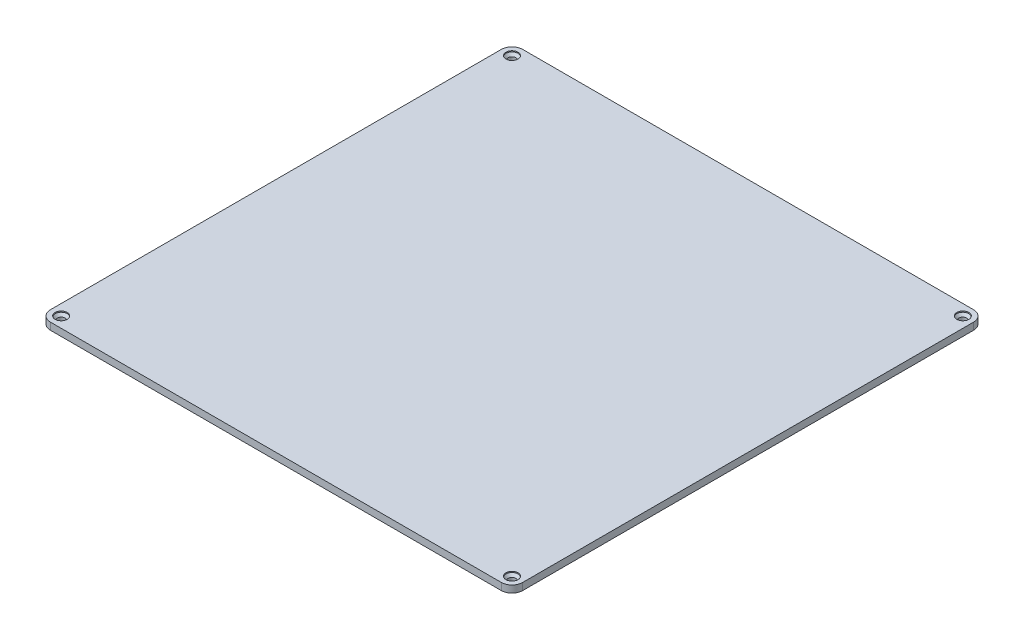
ISO-10303-21;
HEADER;
FILE_DESCRIPTION(('STEP AP214'),'2;1');
FILE_NAME('part.step','',(''),(''),'','','');
FILE_SCHEMA(('AUTOMOTIVE_DESIGN { 1 0 10303 214 1 1 1 1 }'));
ENDSEC;
DATA;
#1=APPLICATION_CONTEXT('core data for automotive mechanical design processes');
#2=APPLICATION_PROTOCOL_DEFINITION('international standard','automotive_design',2000,#1);
#3=PRODUCT_CONTEXT('',#1,'mechanical');
#4=PRODUCT('Part','Part','',(#3));
#5=PRODUCT_RELATED_PRODUCT_CATEGORY('part','',(#4));
#6=PRODUCT_DEFINITION_FORMATION('','',#4);
#7=PRODUCT_DEFINITION_CONTEXT('part definition',#1,'design');
#8=PRODUCT_DEFINITION('design','',#6,#7);
#9=PRODUCT_DEFINITION_SHAPE('','',#8);
#10=(LENGTH_UNIT() NAMED_UNIT(*) SI_UNIT(.MILLI.,.METRE.));
#11=(NAMED_UNIT(*) PLANE_ANGLE_UNIT() SI_UNIT($,.RADIAN.));
#12=(NAMED_UNIT(*) SI_UNIT($,.STERADIAN.) SOLID_ANGLE_UNIT());
#13=UNCERTAINTY_MEASURE_WITH_UNIT(LENGTH_MEASURE(1.E-05),#10,'distance_accuracy_value','');
#14=(GEOMETRIC_REPRESENTATION_CONTEXT(3) GLOBAL_UNCERTAINTY_ASSIGNED_CONTEXT((#13)) GLOBAL_UNIT_ASSIGNED_CONTEXT((#10,
#11,#12)) REPRESENTATION_CONTEXT('',''));
#15=CARTESIAN_POINT('',(0.,0.,0.));
#16=DIRECTION('',(0.,0.,1.));
#17=DIRECTION('',(1.,0.,0.));
#18=AXIS2_PLACEMENT_3D('',#15,#16,#17);
#19=CARTESIAN_POINT('',(-110.,3.3,-110.));
#20=DIRECTION('',(1.,0.,0.));
#21=DIRECTION('',(0.,0.,-1.));
#22=AXIS2_PLACEMENT_3D('',#19,#20,#21);
#23=PLANE('',#22);
#24=DIRECTION('',(0.,0.,1.));
#25=VECTOR('',#24,1.);
#26=CARTESIAN_POINT('',(-110.,3.3,-110.));
#27=LINE('',#26,#25);
#28=CARTESIAN_POINT('',(-110.,3.3,-105.));
#29=VERTEX_POINT('',#28);
#30=CARTESIAN_POINT('',(-110.,3.3,105.));
#31=VERTEX_POINT('',#30);
#32=EDGE_CURVE('E118',#29,#31,#27,.T.);
#33=ORIENTED_EDGE('',*,*,#32,.F.);
#34=DIRECTION('',(0.,-1.,0.));
#35=VECTOR('',#34,1.);
#36=CARTESIAN_POINT('',(-110.,3.3,-105.));
#37=LINE('',#36,#35);
#38=CARTESIAN_POINT('',(-110.,0.,-105.));
#39=VERTEX_POINT('',#38);
#40=EDGE_CURVE('E103',#29,#39,#37,.T.);
#41=ORIENTED_EDGE('',*,*,#40,.T.);
#42=DIRECTION('',(0.,0.,1.));
#43=VECTOR('',#42,1.);
#44=CARTESIAN_POINT('',(-110.,0.,-110.));
#45=LINE('',#44,#43);
#46=CARTESIAN_POINT('',(-110.,0.,105.));
#47=VERTEX_POINT('',#46);
#48=EDGE_CURVE('E115',#39,#47,#45,.T.);
#49=ORIENTED_EDGE('',*,*,#48,.T.);
#50=DIRECTION('',(0.,-1.,0.));
#51=VECTOR('',#50,1.);
#52=CARTESIAN_POINT('',(-110.,3.3,105.));
#53=LINE('',#52,#51);
#54=EDGE_CURVE('E120',#47,#31,#53,.F.);
#55=ORIENTED_EDGE('',*,*,#54,.T.);
#56=EDGE_LOOP('',(#33,#41,#49,#55));
#57=FACE_BOUND('',#56,.T.);
#58=ADVANCED_FACE('F32',(#57),#23,.F.);
#59=CARTESIAN_POINT('',(-110.,3.3,110.));
#60=DIRECTION('',(0.,0.,-1.));
#61=DIRECTION('',(-1.,0.,0.));
#62=AXIS2_PLACEMENT_3D('',#59,#60,#61);
#63=PLANE('',#62);
#64=DIRECTION('',(1.,0.,0.));
#65=VECTOR('',#64,1.);
#66=CARTESIAN_POINT('',(-110.,3.3,110.));
#67=LINE('',#66,#65);
#68=CARTESIAN_POINT('',(-105.,3.3,110.));
#69=VERTEX_POINT('',#68);
#70=CARTESIAN_POINT('',(105.,3.3,110.));
#71=VERTEX_POINT('',#70);
#72=EDGE_CURVE('E202',#69,#71,#67,.T.);
#73=ORIENTED_EDGE('',*,*,#72,.F.);
#74=DIRECTION('',(0.,-1.,0.));
#75=VECTOR('',#74,1.);
#76=CARTESIAN_POINT('',(-105.,3.3,110.));
#77=LINE('',#76,#75);
#78=CARTESIAN_POINT('',(-105.,0.,110.));
#79=VERTEX_POINT('',#78);
#80=EDGE_CURVE('E157',#69,#79,#77,.T.);
#81=ORIENTED_EDGE('',*,*,#80,.T.);
#82=DIRECTION('',(1.,0.,0.));
#83=VECTOR('',#82,1.);
#84=CARTESIAN_POINT('',(-110.,0.,110.));
#85=LINE('',#84,#83);
#86=CARTESIAN_POINT('',(105.,0.,110.));
#87=VERTEX_POINT('',#86);
#88=EDGE_CURVE('E124',#79,#87,#85,.T.);
#89=ORIENTED_EDGE('',*,*,#88,.T.);
#90=DIRECTION('',(0.,-1.,0.));
#91=VECTOR('',#90,1.);
#92=CARTESIAN_POINT('',(105.,3.3,110.));
#93=LINE('',#92,#91);
#94=EDGE_CURVE('E155',#87,#71,#93,.F.);
#95=ORIENTED_EDGE('',*,*,#94,.T.);
#96=EDGE_LOOP('',(#73,#81,#89,#95));
#97=FACE_BOUND('',#96,.T.);
#98=ADVANCED_FACE('F220',(#97),#63,.F.);
#99=CARTESIAN_POINT('',(110.,3.3,-110.));
#100=DIRECTION('',(-1.,0.,0.));
#101=DIRECTION('',(0.,0.,1.));
#102=AXIS2_PLACEMENT_3D('',#99,#100,#101);
#103=PLANE('',#102);
#104=DIRECTION('',(0.,0.,-1.));
#105=VECTOR('',#104,1.);
#106=CARTESIAN_POINT('',(110.,0.,-110.));
#107=LINE('',#106,#105);
#108=CARTESIAN_POINT('',(110.,0.,105.));
#109=VERTEX_POINT('',#108);
#110=CARTESIAN_POINT('',(110.,0.,-105.));
#111=VERTEX_POINT('',#110);
#112=EDGE_CURVE('E128',#109,#111,#107,.T.);
#113=ORIENTED_EDGE('',*,*,#112,.T.);
#114=DIRECTION('',(0.,-1.,0.));
#115=VECTOR('',#114,1.);
#116=CARTESIAN_POINT('',(110.,3.3,-105.));
#117=LINE('',#116,#115);
#118=CARTESIAN_POINT('',(110.,3.3,-105.));
#119=VERTEX_POINT('',#118);
#120=EDGE_CURVE('E11',#111,#119,#117,.F.);
#121=ORIENTED_EDGE('',*,*,#120,.T.);
#122=DIRECTION('',(0.,0.,-1.));
#123=VECTOR('',#122,1.);
#124=CARTESIAN_POINT('',(110.,3.3,-110.));
#125=LINE('',#124,#123);
#126=CARTESIAN_POINT('',(110.,3.3,105.));
#127=VERTEX_POINT('',#126);
#128=EDGE_CURVE('E203',#127,#119,#125,.T.);
#129=ORIENTED_EDGE('',*,*,#128,.F.);
#130=DIRECTION('',(0.,-1.,0.));
#131=VECTOR('',#130,1.);
#132=CARTESIAN_POINT('',(110.,3.3,105.));
#133=LINE('',#132,#131);
#134=EDGE_CURVE('E41',#127,#109,#133,.T.);
#135=ORIENTED_EDGE('',*,*,#134,.T.);
#136=EDGE_LOOP('',(#113,#121,#129,#135));
#137=FACE_BOUND('',#136,.T.);
#138=ADVANCED_FACE('F214',(#137),#103,.F.);
#139=CARTESIAN_POINT('',(-110.,3.3,-110.));
#140=DIRECTION('',(0.,0.,1.));
#141=DIRECTION('',(1.,0.,0.));
#142=AXIS2_PLACEMENT_3D('',#139,#140,#141);
#143=PLANE('',#142);
#144=DIRECTION('',(-1.,0.,0.));
#145=VECTOR('',#144,1.);
#146=CARTESIAN_POINT('',(-110.,0.,-110.));
#147=LINE('',#146,#145);
#148=CARTESIAN_POINT('',(105.,0.,-110.));
#149=VERTEX_POINT('',#148);
#150=CARTESIAN_POINT('',(-105.,0.,-110.));
#151=VERTEX_POINT('',#150);
#152=EDGE_CURVE('E138',#149,#151,#147,.T.);
#153=ORIENTED_EDGE('',*,*,#152,.T.);
#154=DIRECTION('',(0.,-1.,0.));
#155=VECTOR('',#154,1.);
#156=CARTESIAN_POINT('',(-105.,3.3,-110.));
#157=LINE('',#156,#155);
#158=CARTESIAN_POINT('',(-105.,3.3,-110.));
#159=VERTEX_POINT('',#158);
#160=EDGE_CURVE('E104',#151,#159,#157,.F.);
#161=ORIENTED_EDGE('',*,*,#160,.T.);
#162=DIRECTION('',(-1.,0.,0.));
#163=VECTOR('',#162,1.);
#164=CARTESIAN_POINT('',(-110.,3.3,-110.));
#165=LINE('',#164,#163);
#166=CARTESIAN_POINT('',(105.,3.3,-110.));
#167=VERTEX_POINT('',#166);
#168=EDGE_CURVE('E134',#167,#159,#165,.T.);
#169=ORIENTED_EDGE('',*,*,#168,.F.);
#170=DIRECTION('',(0.,-1.,0.));
#171=VECTOR('',#170,1.);
#172=CARTESIAN_POINT('',(105.,3.3,-110.));
#173=LINE('',#172,#171);
#174=EDGE_CURVE('E109',#167,#149,#173,.T.);
#175=ORIENTED_EDGE('',*,*,#174,.T.);
#176=EDGE_LOOP('',(#153,#161,#169,#175));
#177=FACE_BOUND('',#176,.T.);
#178=ADVANCED_FACE('F210',(#177),#143,.F.);
#179=CARTESIAN_POINT('',(-110.,3.3,110.));
#180=DIRECTION('',(0.,1.,0.));
#181=DIRECTION('',(0.,0.,1.));
#182=AXIS2_PLACEMENT_3D('',#179,#180,#181);
#183=PLANE('',#182);
#184=CARTESIAN_POINT('',(105.,3.3,105.));
#185=DIRECTION('',(0.,-1.,0.));
#186=DIRECTION('',(0.,0.,-1.));
#187=AXIS2_PLACEMENT_3D('',#184,#185,#186);
#188=CIRCLE('',#187,2.8);
#189=CARTESIAN_POINT('',(105.,3.3,102.2));
#190=VERTEX_POINT('',#189);
#191=EDGE_CURVE('E303',#190,#190,#188,.T.);
#192=ORIENTED_EDGE('',*,*,#191,.T.);
#193=EDGE_LOOP('',(#192));
#194=FACE_BOUND('',#193,.T.);
#195=CARTESIAN_POINT('',(105.,3.3,-105.));
#196=DIRECTION('',(0.,-1.,0.));
#197=DIRECTION('',(0.,0.,-1.));
#198=AXIS2_PLACEMENT_3D('',#195,#196,#197);
#199=CIRCLE('',#198,2.8);
#200=CARTESIAN_POINT('',(105.,3.3,-107.8));
#201=VERTEX_POINT('',#200);
#202=EDGE_CURVE('E174',#201,#201,#199,.T.);
#203=ORIENTED_EDGE('',*,*,#202,.T.);
#204=EDGE_LOOP('',(#203));
#205=FACE_BOUND('',#204,.T.);
#206=CARTESIAN_POINT('',(-105.,3.3,105.));
#207=DIRECTION('',(0.,-1.,0.));
#208=DIRECTION('',(0.,0.,-1.));
#209=AXIS2_PLACEMENT_3D('',#206,#207,#208);
#210=CIRCLE('',#209,2.8);
#211=CARTESIAN_POINT('',(-105.,3.3,102.2));
#212=VERTEX_POINT('',#211);
#213=EDGE_CURVE('E170',#212,#212,#210,.T.);
#214=ORIENTED_EDGE('',*,*,#213,.T.);
#215=EDGE_LOOP('',(#214));
#216=FACE_BOUND('',#215,.T.);
#217=CARTESIAN_POINT('',(-105.,3.3,-105.));
#218=DIRECTION('',(0.,-1.,0.));
#219=DIRECTION('',(0.,0.,-1.));
#220=AXIS2_PLACEMENT_3D('',#217,#218,#219);
#221=CIRCLE('',#220,2.8);
#222=CARTESIAN_POINT('',(-105.,3.3,-107.8));
#223=VERTEX_POINT('',#222);
#224=EDGE_CURVE('E166',#223,#223,#221,.T.);
#225=ORIENTED_EDGE('',*,*,#224,.T.);
#226=EDGE_LOOP('',(#225));
#227=FACE_BOUND('',#226,.T.);
#228=ORIENTED_EDGE('',*,*,#168,.T.);
#229=CARTESIAN_POINT('',(-105.,3.3,-105.));
#230=DIRECTION('',(0.,1.,0.));
#231=DIRECTION('',(0.,0.,1.));
#232=AXIS2_PLACEMENT_3D('',#229,#230,#231);
#233=CIRCLE('',#232,5.);
#234=EDGE_CURVE('E153',#159,#29,#233,.T.);
#235=ORIENTED_EDGE('',*,*,#234,.T.);
#236=ORIENTED_EDGE('',*,*,#32,.T.);
#237=CARTESIAN_POINT('',(-105.,3.3,105.));
#238=DIRECTION('',(0.,1.,0.));
#239=DIRECTION('',(0.,0.,1.));
#240=AXIS2_PLACEMENT_3D('',#237,#238,#239);
#241=CIRCLE('',#240,5.);
#242=EDGE_CURVE('E151',#31,#69,#241,.T.);
#243=ORIENTED_EDGE('',*,*,#242,.T.);
#244=ORIENTED_EDGE('',*,*,#72,.T.);
#245=CARTESIAN_POINT('',(105.,3.3,105.));
#246=DIRECTION('',(0.,1.,0.));
#247=DIRECTION('',(0.,0.,1.));
#248=AXIS2_PLACEMENT_3D('',#245,#246,#247);
#249=CIRCLE('',#248,5.);
#250=EDGE_CURVE('E54',#71,#127,#249,.T.);
#251=ORIENTED_EDGE('',*,*,#250,.T.);
#252=ORIENTED_EDGE('',*,*,#128,.T.);
#253=CARTESIAN_POINT('',(105.,3.3,-105.));
#254=DIRECTION('',(0.,1.,0.));
#255=DIRECTION('',(0.,0.,1.));
#256=AXIS2_PLACEMENT_3D('',#253,#254,#255);
#257=CIRCLE('',#256,5.);
#258=EDGE_CURVE('E149',#119,#167,#257,.T.);
#259=ORIENTED_EDGE('',*,*,#258,.T.);
#260=EDGE_LOOP('',(#228,#235,#236,#243,#244,#251,#252,#259));
#261=FACE_BOUND('',#260,.T.);
#262=ADVANCED_FACE('F207',(#194,#205,#216,#227,#261),#183,.T.);
#263=CARTESIAN_POINT('',(-110.,0.,110.));
#264=DIRECTION('',(0.,1.,0.));
#265=DIRECTION('',(0.,0.,1.));
#266=AXIS2_PLACEMENT_3D('',#263,#264,#265);
#267=PLANE('',#266);
#268=CARTESIAN_POINT('',(-104.999999999998,0.,105.));
#269=DIRECTION('',(0.,1.,0.));
#270=DIRECTION('',(0.,0.,1.));
#271=AXIS2_PLACEMENT_3D('',#268,#269,#270);
#272=CIRCLE('',#271,1.75);
#273=CARTESIAN_POINT('',(-104.999999999998,0.,106.75));
#274=VERTEX_POINT('',#273);
#275=EDGE_CURVE('E165',#274,#274,#272,.T.);
#276=ORIENTED_EDGE('',*,*,#275,.T.);
#277=EDGE_LOOP('',(#276));
#278=FACE_BOUND('',#277,.T.);
#279=CARTESIAN_POINT('',(105.000000000002,0.,105.));
#280=DIRECTION('',(0.,1.,0.));
#281=DIRECTION('',(0.,0.,1.));
#282=AXIS2_PLACEMENT_3D('',#279,#280,#281);
#283=CIRCLE('',#282,1.75);
#284=CARTESIAN_POINT('',(105.000000000002,0.,106.75));
#285=VERTEX_POINT('',#284);
#286=EDGE_CURVE('E196',#285,#285,#283,.T.);
#287=ORIENTED_EDGE('',*,*,#286,.T.);
#288=EDGE_LOOP('',(#287));
#289=FACE_BOUND('',#288,.T.);
#290=CARTESIAN_POINT('',(105.,0.,-105.));
#291=DIRECTION('',(0.,1.,0.));
#292=DIRECTION('',(0.,0.,1.));
#293=AXIS2_PLACEMENT_3D('',#290,#291,#292);
#294=CIRCLE('',#293,1.75);
#295=CARTESIAN_POINT('',(105.,0.,-103.25));
#296=VERTEX_POINT('',#295);
#297=EDGE_CURVE('E131',#296,#296,#294,.T.);
#298=ORIENTED_EDGE('',*,*,#297,.T.);
#299=EDGE_LOOP('',(#298));
#300=FACE_BOUND('',#299,.T.);
#301=CARTESIAN_POINT('',(-105.,0.,-105.));
#302=DIRECTION('',(0.,1.,0.));
#303=DIRECTION('',(0.,0.,1.));
#304=AXIS2_PLACEMENT_3D('',#301,#302,#303);
#305=CIRCLE('',#304,1.75);
#306=CARTESIAN_POINT('',(-105.,0.,-103.25));
#307=VERTEX_POINT('',#306);
#308=EDGE_CURVE('E125',#307,#307,#305,.T.);
#309=ORIENTED_EDGE('',*,*,#308,.T.);
#310=EDGE_LOOP('',(#309));
#311=FACE_BOUND('',#310,.T.);
#312=ORIENTED_EDGE('',*,*,#48,.F.);
#313=CARTESIAN_POINT('',(-105.,0.,-105.));
#314=DIRECTION('',(0.,1.,0.));
#315=DIRECTION('',(0.,0.,1.));
#316=AXIS2_PLACEMENT_3D('',#313,#314,#315);
#317=CIRCLE('',#316,5.);
#318=EDGE_CURVE('E99',#39,#151,#317,.F.);
#319=ORIENTED_EDGE('',*,*,#318,.T.);
#320=ORIENTED_EDGE('',*,*,#152,.F.);
#321=CARTESIAN_POINT('',(105.,0.,-105.));
#322=DIRECTION('',(0.,1.,0.));
#323=DIRECTION('',(0.,0.,1.));
#324=AXIS2_PLACEMENT_3D('',#321,#322,#323);
#325=CIRCLE('',#324,5.);
#326=EDGE_CURVE('E142',#149,#111,#325,.F.);
#327=ORIENTED_EDGE('',*,*,#326,.T.);
#328=ORIENTED_EDGE('',*,*,#112,.F.);
#329=CARTESIAN_POINT('',(105.,0.,105.));
#330=DIRECTION('',(0.,1.,0.));
#331=DIRECTION('',(0.,0.,1.));
#332=AXIS2_PLACEMENT_3D('',#329,#330,#331);
#333=CIRCLE('',#332,5.);
#334=EDGE_CURVE('E119',#109,#87,#333,.F.);
#335=ORIENTED_EDGE('',*,*,#334,.T.);
#336=ORIENTED_EDGE('',*,*,#88,.F.);
#337=CARTESIAN_POINT('',(-105.,0.,105.));
#338=DIRECTION('',(0.,1.,0.));
#339=DIRECTION('',(0.,0.,1.));
#340=AXIS2_PLACEMENT_3D('',#337,#338,#339);
#341=CIRCLE('',#340,5.);
#342=EDGE_CURVE('E110',#79,#47,#341,.F.);
#343=ORIENTED_EDGE('',*,*,#342,.T.);
#344=EDGE_LOOP('',(#312,#319,#320,#327,#328,#335,#336,#343));
#345=FACE_BOUND('',#344,.T.);
#346=ADVANCED_FACE('F122',(#278,#289,#300,#311,#345),#267,.F.);
#347=CARTESIAN_POINT('',(-105.,3.3,-105.));
#348=DIRECTION('',(0.,-1.,0.));
#349=DIRECTION('',(0.,0.,-1.));
#350=AXIS2_PLACEMENT_3D('',#347,#348,#349);
#351=CYLINDRICAL_SURFACE('',#350,5.);
#352=ORIENTED_EDGE('',*,*,#234,.F.);
#353=ORIENTED_EDGE('',*,*,#160,.F.);
#354=ORIENTED_EDGE('',*,*,#318,.F.);
#355=ORIENTED_EDGE('',*,*,#40,.F.);
#356=EDGE_LOOP('',(#352,#353,#354,#355));
#357=FACE_BOUND('',#356,.T.);
#358=ADVANCED_FACE('F102',(#357),#351,.T.);
#359=CARTESIAN_POINT('',(-105.,3.3,105.));
#360=DIRECTION('',(0.,-1.,0.));
#361=DIRECTION('',(0.,0.,-1.));
#362=AXIS2_PLACEMENT_3D('',#359,#360,#361);
#363=CYLINDRICAL_SURFACE('',#362,5.);
#364=ORIENTED_EDGE('',*,*,#242,.F.);
#365=ORIENTED_EDGE('',*,*,#54,.F.);
#366=ORIENTED_EDGE('',*,*,#342,.F.);
#367=ORIENTED_EDGE('',*,*,#80,.F.);
#368=EDGE_LOOP('',(#364,#365,#366,#367));
#369=FACE_BOUND('',#368,.T.);
#370=ADVANCED_FACE('F224',(#369),#363,.T.);
#371=CARTESIAN_POINT('',(105.,3.3,-105.));
#372=DIRECTION('',(0.,-1.,0.));
#373=DIRECTION('',(0.,0.,-1.));
#374=AXIS2_PLACEMENT_3D('',#371,#372,#373);
#375=CYLINDRICAL_SURFACE('',#374,5.);
#376=ORIENTED_EDGE('',*,*,#258,.F.);
#377=ORIENTED_EDGE('',*,*,#120,.F.);
#378=ORIENTED_EDGE('',*,*,#326,.F.);
#379=ORIENTED_EDGE('',*,*,#174,.F.);
#380=EDGE_LOOP('',(#376,#377,#378,#379));
#381=FACE_BOUND('',#380,.T.);
#382=ADVANCED_FACE('F212',(#381),#375,.T.);
#383=CARTESIAN_POINT('',(105.,3.3,105.));
#384=DIRECTION('',(0.,-1.,0.));
#385=DIRECTION('',(0.,0.,-1.));
#386=AXIS2_PLACEMENT_3D('',#383,#384,#385);
#387=CYLINDRICAL_SURFACE('',#386,5.);
#388=ORIENTED_EDGE('',*,*,#250,.F.);
#389=ORIENTED_EDGE('',*,*,#94,.F.);
#390=ORIENTED_EDGE('',*,*,#334,.F.);
#391=ORIENTED_EDGE('',*,*,#134,.F.);
#392=EDGE_LOOP('',(#388,#389,#390,#391));
#393=FACE_BOUND('',#392,.T.);
#394=ADVANCED_FACE('F34',(#393),#387,.T.);
#395=CARTESIAN_POINT('',(-105.,0.,-105.));
#396=DIRECTION('',(0.,1.,0.));
#397=DIRECTION('',(0.,0.,1.));
#398=AXIS2_PLACEMENT_3D('',#395,#396,#397);
#399=CYLINDRICAL_SURFACE('',#398,1.75);
#400=CARTESIAN_POINT('',(-105.,1.58846153846153,-105.));
#401=DIRECTION('',(0.,1.,0.));
#402=DIRECTION('',(0.,0.,1.));
#403=AXIS2_PLACEMENT_3D('',#400,#401,#402);
#404=CIRCLE('',#403,1.75);
#405=CARTESIAN_POINT('',(-105.,1.58846153846153,-103.25));
#406=VERTEX_POINT('',#405);
#407=EDGE_CURVE('E162',#406,#406,#404,.T.);
#408=ORIENTED_EDGE('',*,*,#407,.T.);
#409=EDGE_LOOP('',(#408));
#410=FACE_BOUND('',#409,.T.);
#411=ORIENTED_EDGE('',*,*,#308,.F.);
#412=EDGE_LOOP('',(#411));
#413=FACE_BOUND('',#412,.T.);
#414=ADVANCED_FACE('F249',(#410,#413),#399,.F.);
#415=CARTESIAN_POINT('',(105.,0.,-105.));
#416=DIRECTION('',(0.,1.,0.));
#417=DIRECTION('',(0.,0.,1.));
#418=AXIS2_PLACEMENT_3D('',#415,#416,#417);
#419=CYLINDRICAL_SURFACE('',#418,1.75);
#420=CARTESIAN_POINT('',(105.,1.58846153846153,-105.));
#421=DIRECTION('',(0.,1.,0.));
#422=DIRECTION('',(0.,0.,1.));
#423=AXIS2_PLACEMENT_3D('',#420,#421,#422);
#424=CIRCLE('',#423,1.75);
#425=CARTESIAN_POINT('',(105.,1.58846153846153,-103.25));
#426=VERTEX_POINT('',#425);
#427=EDGE_CURVE('E171',#426,#426,#424,.T.);
#428=ORIENTED_EDGE('',*,*,#427,.T.);
#429=EDGE_LOOP('',(#428));
#430=FACE_BOUND('',#429,.T.);
#431=ORIENTED_EDGE('',*,*,#297,.F.);
#432=EDGE_LOOP('',(#431));
#433=FACE_BOUND('',#432,.T.);
#434=ADVANCED_FACE('F252',(#430,#433),#419,.F.);
#435=CARTESIAN_POINT('',(105.000000000002,0.,105.));
#436=DIRECTION('',(0.,1.,0.));
#437=DIRECTION('',(0.,0.,1.));
#438=AXIS2_PLACEMENT_3D('',#435,#436,#437);
#439=CYLINDRICAL_SURFACE('',#438,1.75);
#440=CARTESIAN_POINT('',(105.,1.58846153846153,105.));
#441=DIRECTION('',(0.,1.,0.));
#442=DIRECTION('',(0.,0.,1.));
#443=AXIS2_PLACEMENT_3D('',#440,#441,#442);
#444=CIRCLE('',#443,1.75);
#445=CARTESIAN_POINT('',(105.,1.58846153846153,106.75));
#446=VERTEX_POINT('',#445);
#447=EDGE_CURVE('E36',#446,#446,#444,.T.);
#448=ORIENTED_EDGE('',*,*,#447,.T.);
#449=EDGE_LOOP('',(#448));
#450=FACE_BOUND('',#449,.T.);
#451=ORIENTED_EDGE('',*,*,#286,.F.);
#452=EDGE_LOOP('',(#451));
#453=FACE_BOUND('',#452,.T.);
#454=ADVANCED_FACE('F256',(#450,#453),#439,.F.);
#455=CARTESIAN_POINT('',(-104.999999999998,0.,105.));
#456=DIRECTION('',(0.,1.,0.));
#457=DIRECTION('',(0.,0.,1.));
#458=AXIS2_PLACEMENT_3D('',#455,#456,#457);
#459=CYLINDRICAL_SURFACE('',#458,1.75);
#460=CARTESIAN_POINT('',(-105.,1.58846153846153,105.));
#461=DIRECTION('',(0.,1.,0.));
#462=DIRECTION('',(0.,0.,1.));
#463=AXIS2_PLACEMENT_3D('',#460,#461,#462);
#464=CIRCLE('',#463,1.75);
#465=CARTESIAN_POINT('',(-105.,1.58846153846153,106.75));
#466=VERTEX_POINT('',#465);
#467=EDGE_CURVE('E167',#466,#466,#464,.T.);
#468=ORIENTED_EDGE('',*,*,#467,.T.);
#469=EDGE_LOOP('',(#468));
#470=FACE_BOUND('',#469,.T.);
#471=ORIENTED_EDGE('',*,*,#275,.F.);
#472=EDGE_LOOP('',(#471));
#473=FACE_BOUND('',#472,.T.);
#474=ADVANCED_FACE('F259',(#470,#473),#459,.F.);
#475=CARTESIAN_POINT('',(-105.,1.3,-105.));
#476=DIRECTION('',(0.,1.,0.));
#477=DIRECTION('',(0.,0.,1.));
#478=AXIS2_PLACEMENT_3D('',#475,#476,#477);
#479=CONICAL_SURFACE('',#478,1.5,0.714090698612156);
#480=CARTESIAN_POINT('',(-105.,2.8,-105.));
#481=DIRECTION('',(0.,-1.,0.));
#482=DIRECTION('',(0.,0.,-1.));
#483=AXIS2_PLACEMENT_3D('',#480,#481,#482);
#484=CIRCLE('',#483,2.8);
#485=CARTESIAN_POINT('',(-105.,2.8,-107.8));
#486=VERTEX_POINT('',#485);
#487=EDGE_CURVE('E169',#486,#486,#484,.T.);
#488=ORIENTED_EDGE('',*,*,#487,.F.);
#489=EDGE_LOOP('',(#488));
#490=FACE_BOUND('',#489,.T.);
#491=ORIENTED_EDGE('',*,*,#407,.F.);
#492=EDGE_LOOP('',(#491));
#493=FACE_BOUND('',#492,.T.);
#494=ADVANCED_FACE('F263',(#490,#493),#479,.F.);
#495=CARTESIAN_POINT('',(-105.,1.3,-105.));
#496=DIRECTION('',(0.,-1.,0.));
#497=DIRECTION('',(0.,0.,-1.));
#498=AXIS2_PLACEMENT_3D('',#495,#496,#497);
#499=CYLINDRICAL_SURFACE('',#498,2.8);
#500=ORIENTED_EDGE('',*,*,#224,.F.);
#501=EDGE_LOOP('',(#500));
#502=FACE_BOUND('',#501,.T.);
#503=ORIENTED_EDGE('',*,*,#487,.T.);
#504=EDGE_LOOP('',(#503));
#505=FACE_BOUND('',#504,.T.);
#506=ADVANCED_FACE('F265',(#502,#505),#499,.F.);
#507=CARTESIAN_POINT('',(-105.,1.3,105.));
#508=DIRECTION('',(0.,1.,0.));
#509=DIRECTION('',(0.,0.,1.));
#510=AXIS2_PLACEMENT_3D('',#507,#508,#509);
#511=CONICAL_SURFACE('',#510,1.5,0.714090698612156);
#512=CARTESIAN_POINT('',(-105.,2.8,105.));
#513=DIRECTION('',(0.,-1.,0.));
#514=DIRECTION('',(0.,0.,-1.));
#515=AXIS2_PLACEMENT_3D('',#512,#513,#514);
#516=CIRCLE('',#515,2.8);
#517=CARTESIAN_POINT('',(-105.,2.8,102.2));
#518=VERTEX_POINT('',#517);
#519=EDGE_CURVE('E173',#518,#518,#516,.T.);
#520=ORIENTED_EDGE('',*,*,#519,.F.);
#521=EDGE_LOOP('',(#520));
#522=FACE_BOUND('',#521,.T.);
#523=ORIENTED_EDGE('',*,*,#467,.F.);
#524=EDGE_LOOP('',(#523));
#525=FACE_BOUND('',#524,.T.);
#526=ADVANCED_FACE('F268',(#522,#525),#511,.F.);
#527=CARTESIAN_POINT('',(-105.,1.3,105.));
#528=DIRECTION('',(0.,-1.,0.));
#529=DIRECTION('',(0.,0.,-1.));
#530=AXIS2_PLACEMENT_3D('',#527,#528,#529);
#531=CYLINDRICAL_SURFACE('',#530,2.8);
#532=ORIENTED_EDGE('',*,*,#213,.F.);
#533=EDGE_LOOP('',(#532));
#534=FACE_BOUND('',#533,.T.);
#535=ORIENTED_EDGE('',*,*,#519,.T.);
#536=EDGE_LOOP('',(#535));
#537=FACE_BOUND('',#536,.T.);
#538=ADVANCED_FACE('F273',(#534,#537),#531,.F.);
#539=CARTESIAN_POINT('',(105.,1.3,-105.));
#540=DIRECTION('',(0.,1.,0.));
#541=DIRECTION('',(0.,0.,1.));
#542=AXIS2_PLACEMENT_3D('',#539,#540,#541);
#543=CONICAL_SURFACE('',#542,1.5,0.714090698612156);
#544=CARTESIAN_POINT('',(105.,2.8,-105.));
#545=DIRECTION('',(0.,-1.,0.));
#546=DIRECTION('',(0.,0.,-1.));
#547=AXIS2_PLACEMENT_3D('',#544,#545,#546);
#548=CIRCLE('',#547,2.8);
#549=CARTESIAN_POINT('',(105.,2.8,-107.8));
#550=VERTEX_POINT('',#549);
#551=EDGE_CURVE('E180',#550,#550,#548,.T.);
#552=ORIENTED_EDGE('',*,*,#551,.F.);
#553=EDGE_LOOP('',(#552));
#554=FACE_BOUND('',#553,.T.);
#555=ORIENTED_EDGE('',*,*,#427,.F.);
#556=EDGE_LOOP('',(#555));
#557=FACE_BOUND('',#556,.T.);
#558=ADVANCED_FACE('F276',(#554,#557),#543,.F.);
#559=CARTESIAN_POINT('',(105.,1.3,-105.));
#560=DIRECTION('',(0.,-1.,0.));
#561=DIRECTION('',(0.,0.,-1.));
#562=AXIS2_PLACEMENT_3D('',#559,#560,#561);
#563=CYLINDRICAL_SURFACE('',#562,2.8);
#564=ORIENTED_EDGE('',*,*,#202,.F.);
#565=EDGE_LOOP('',(#564));
#566=FACE_BOUND('',#565,.T.);
#567=ORIENTED_EDGE('',*,*,#551,.T.);
#568=EDGE_LOOP('',(#567));
#569=FACE_BOUND('',#568,.T.);
#570=ADVANCED_FACE('F281',(#566,#569),#563,.F.);
#571=CARTESIAN_POINT('',(105.,1.3,105.));
#572=DIRECTION('',(0.,1.,0.));
#573=DIRECTION('',(0.,0.,1.));
#574=AXIS2_PLACEMENT_3D('',#571,#572,#573);
#575=CONICAL_SURFACE('',#574,1.5,0.714090698612156);
#576=CARTESIAN_POINT('',(105.,2.8,105.));
#577=DIRECTION('',(0.,-1.,0.));
#578=DIRECTION('',(0.,0.,-1.));
#579=AXIS2_PLACEMENT_3D('',#576,#577,#578);
#580=CIRCLE('',#579,2.8);
#581=CARTESIAN_POINT('',(105.,2.8,102.2));
#582=VERTEX_POINT('',#581);
#583=EDGE_CURVE('E300',#582,#582,#580,.T.);
#584=ORIENTED_EDGE('',*,*,#583,.F.);
#585=EDGE_LOOP('',(#584));
#586=FACE_BOUND('',#585,.T.);
#587=ORIENTED_EDGE('',*,*,#447,.F.);
#588=EDGE_LOOP('',(#587));
#589=FACE_BOUND('',#588,.T.);
#590=ADVANCED_FACE('F284',(#586,#589),#575,.F.);
#591=CARTESIAN_POINT('',(105.,1.3,105.));
#592=DIRECTION('',(0.,-1.,0.));
#593=DIRECTION('',(0.,0.,-1.));
#594=AXIS2_PLACEMENT_3D('',#591,#592,#593);
#595=CYLINDRICAL_SURFACE('',#594,2.8);
#596=ORIENTED_EDGE('',*,*,#191,.F.);
#597=EDGE_LOOP('',(#596));
#598=FACE_BOUND('',#597,.T.);
#599=ORIENTED_EDGE('',*,*,#583,.T.);
#600=EDGE_LOOP('',(#599));
#601=FACE_BOUND('',#600,.T.);
#602=ADVANCED_FACE('F289',(#598,#601),#595,.F.);
#603=CLOSED_SHELL('',(#58,#98,#138,#178,#262,#346,#358,#370,#382,#394,#414,#434,#454,#474,#494,
#506,#526,#538,#558,#570,#590,#602));
#604=MANIFOLD_SOLID_BREP('B2',#603);
#605=ADVANCED_BREP_SHAPE_REPRESENTATION('',(#18,#604),#14);
#606=SHAPE_DEFINITION_REPRESENTATION(#9,#605);
ENDSEC;
END-ISO-10303-21;
